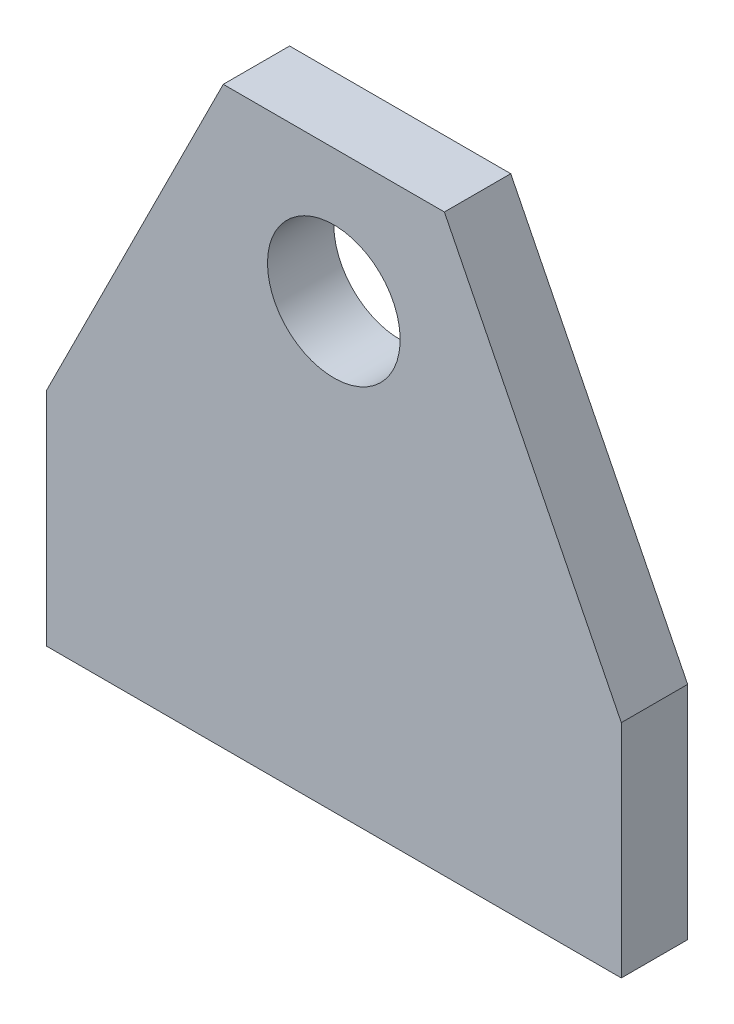
ISO-10303-21;
HEADER;
FILE_DESCRIPTION(('STEP AP214'),'2;1');
FILE_NAME('part.step','',(''),(''),'','','');
FILE_SCHEMA(('AUTOMOTIVE_DESIGN { 1 0 10303 214 1 1 1 1 }'));
ENDSEC;
DATA;
#1=APPLICATION_CONTEXT('core data for automotive mechanical design processes');
#2=APPLICATION_PROTOCOL_DEFINITION('international standard','automotive_design',2000,#1);
#3=PRODUCT_CONTEXT('',#1,'mechanical');
#4=PRODUCT('Part','Part','',(#3));
#5=PRODUCT_RELATED_PRODUCT_CATEGORY('part','',(#4));
#6=PRODUCT_DEFINITION_FORMATION('','',#4);
#7=PRODUCT_DEFINITION_CONTEXT('part definition',#1,'design');
#8=PRODUCT_DEFINITION('design','',#6,#7);
#9=PRODUCT_DEFINITION_SHAPE('','',#8);
#10=(LENGTH_UNIT() NAMED_UNIT(*) SI_UNIT(.MILLI.,.METRE.));
#11=(NAMED_UNIT(*) PLANE_ANGLE_UNIT() SI_UNIT($,.RADIAN.));
#12=(NAMED_UNIT(*) SI_UNIT($,.STERADIAN.) SOLID_ANGLE_UNIT());
#13=UNCERTAINTY_MEASURE_WITH_UNIT(LENGTH_MEASURE(1.E-05),#10,'distance_accuracy_value','');
#14=(GEOMETRIC_REPRESENTATION_CONTEXT(3) GLOBAL_UNCERTAINTY_ASSIGNED_CONTEXT((#13)) GLOBAL_UNIT_ASSIGNED_CONTEXT((#10,
#11,#12)) REPRESENTATION_CONTEXT('',''));
#15=CARTESIAN_POINT('',(0.,0.,0.));
#16=DIRECTION('',(0.,0.,1.));
#17=DIRECTION('',(1.,0.,0.));
#18=AXIS2_PLACEMENT_3D('',#15,#16,#17);
#19=CARTESIAN_POINT('',(41.275,0.,9.525));
#20=DIRECTION('',(0.,0.,-1.));
#21=DIRECTION('',(-1.,0.,0.));
#22=AXIS2_PLACEMENT_3D('',#19,#20,#21);
#23=PLANE('',#22);
#24=DIRECTION('',(0.,-1.,0.));
#25=VECTOR('',#24,1.);
#26=CARTESIAN_POINT('',(41.275,31.75,9.525));
#27=LINE('',#26,#25);
#28=CARTESIAN_POINT('',(41.275,31.75,9.525));
#29=VERTEX_POINT('',#28);
#30=CARTESIAN_POINT('',(41.275,0.,9.525));
#31=VERTEX_POINT('',#30);
#32=EDGE_CURVE('E132',#29,#31,#27,.T.);
#33=ORIENTED_EDGE('',*,*,#32,.F.);
#34=DIRECTION('',(0.447213595499958,-0.894427190999916,0.));
#35=VECTOR('',#34,1.);
#36=CARTESIAN_POINT('',(15.875,82.55,9.525));
#37=LINE('',#36,#35);
#38=CARTESIAN_POINT('',(15.875,82.55,9.525));
#39=VERTEX_POINT('',#38);
#40=EDGE_CURVE('E112',#39,#29,#37,.T.);
#41=ORIENTED_EDGE('',*,*,#40,.F.);
#42=DIRECTION('',(1.,0.,0.));
#43=VECTOR('',#42,1.);
#44=CARTESIAN_POINT('',(-15.875,82.55,9.525));
#45=LINE('',#44,#43);
#46=CARTESIAN_POINT('',(-15.875,82.55,9.525));
#47=VERTEX_POINT('',#46);
#48=EDGE_CURVE('E96',#47,#39,#45,.T.);
#49=ORIENTED_EDGE('',*,*,#48,.F.);
#50=DIRECTION('',(-0.447213595499958,-0.894427190999916,0.));
#51=VECTOR('',#50,1.);
#52=CARTESIAN_POINT('',(-15.875,82.55,9.525));
#53=LINE('',#52,#51);
#54=CARTESIAN_POINT('',(-41.275,31.75,9.525));
#55=VERTEX_POINT('',#54);
#56=EDGE_CURVE('E104',#47,#55,#53,.T.);
#57=ORIENTED_EDGE('',*,*,#56,.T.);
#58=DIRECTION('',(0.,-1.,0.));
#59=VECTOR('',#58,1.);
#60=CARTESIAN_POINT('',(-41.275,31.75,9.525));
#61=LINE('',#60,#59);
#62=CARTESIAN_POINT('',(-41.275,0.,9.525));
#63=VERTEX_POINT('',#62);
#64=EDGE_CURVE('E109',#55,#63,#61,.T.);
#65=ORIENTED_EDGE('',*,*,#64,.T.);
#66=DIRECTION('',(-1.,0.,0.));
#67=VECTOR('',#66,1.);
#68=CARTESIAN_POINT('',(41.275,0.,9.525));
#69=LINE('',#68,#67);
#70=EDGE_CURVE('E174',#31,#63,#69,.T.);
#71=ORIENTED_EDGE('',*,*,#70,.F.);
#72=EDGE_LOOP('',(#33,#41,#49,#57,#65,#71));
#73=FACE_BOUND('',#72,.T.);
#74=CARTESIAN_POINT('',(0.,63.5,9.525));
#75=DIRECTION('',(0.,0.,1.));
#76=DIRECTION('',(1.,0.,0.));
#77=AXIS2_PLACEMENT_3D('',#74,#75,#76);
#78=CIRCLE('',#77,9.525);
#79=CARTESIAN_POINT('',(-9.525,63.5,9.525));
#80=VERTEX_POINT('',#79);
#81=EDGE_CURVE('E121',#80,#80,#78,.T.);
#82=ORIENTED_EDGE('',*,*,#81,.F.);
#83=EDGE_LOOP('',(#82));
#84=FACE_BOUND('',#83,.T.);
#85=ADVANCED_FACE('F34',(#73,#84),#23,.F.);
#86=CARTESIAN_POINT('',(41.275,0.,0.));
#87=DIRECTION('',(0.,0.,-1.));
#88=DIRECTION('',(-1.,0.,0.));
#89=AXIS2_PLACEMENT_3D('',#86,#87,#88);
#90=PLANE('',#89);
#91=DIRECTION('',(0.,-1.,0.));
#92=VECTOR('',#91,1.);
#93=CARTESIAN_POINT('',(41.275,31.75,0.));
#94=LINE('',#93,#92);
#95=CARTESIAN_POINT('',(41.275,31.75,0.));
#96=VERTEX_POINT('',#95);
#97=CARTESIAN_POINT('',(41.275,0.,0.));
#98=VERTEX_POINT('',#97);
#99=EDGE_CURVE('E117',#96,#98,#94,.T.);
#100=ORIENTED_EDGE('',*,*,#99,.T.);
#101=DIRECTION('',(-1.,0.,0.));
#102=VECTOR('',#101,1.);
#103=CARTESIAN_POINT('',(41.275,0.,0.));
#104=LINE('',#103,#102);
#105=CARTESIAN_POINT('',(-41.275,0.,0.));
#106=VERTEX_POINT('',#105);
#107=EDGE_CURVE('E120',#98,#106,#104,.T.);
#108=ORIENTED_EDGE('',*,*,#107,.T.);
#109=DIRECTION('',(0.,-1.,0.));
#110=VECTOR('',#109,1.);
#111=CARTESIAN_POINT('',(-41.275,31.75,0.));
#112=LINE('',#111,#110);
#113=CARTESIAN_POINT('',(-41.275,31.75,0.));
#114=VERTEX_POINT('',#113);
#115=EDGE_CURVE('E124',#114,#106,#112,.T.);
#116=ORIENTED_EDGE('',*,*,#115,.F.);
#117=DIRECTION('',(-0.447213595499958,-0.894427190999916,0.));
#118=VECTOR('',#117,1.);
#119=CARTESIAN_POINT('',(-15.875,82.55,0.));
#120=LINE('',#119,#118);
#121=CARTESIAN_POINT('',(-15.875,82.55,0.));
#122=VERTEX_POINT('',#121);
#123=EDGE_CURVE('E127',#122,#114,#120,.T.);
#124=ORIENTED_EDGE('',*,*,#123,.F.);
#125=DIRECTION('',(1.,0.,0.));
#126=VECTOR('',#125,1.);
#127=CARTESIAN_POINT('',(-15.875,82.55,0.));
#128=LINE('',#127,#126);
#129=CARTESIAN_POINT('',(15.875,82.55,0.));
#130=VERTEX_POINT('',#129);
#131=EDGE_CURVE('E98',#122,#130,#128,.T.);
#132=ORIENTED_EDGE('',*,*,#131,.T.);
#133=DIRECTION('',(0.447213595499958,-0.894427190999916,0.));
#134=VECTOR('',#133,1.);
#135=CARTESIAN_POINT('',(15.875,82.55,0.));
#136=LINE('',#135,#134);
#137=EDGE_CURVE('E130',#130,#96,#136,.T.);
#138=ORIENTED_EDGE('',*,*,#137,.T.);
#139=EDGE_LOOP('',(#100,#108,#116,#124,#132,#138));
#140=FACE_BOUND('',#139,.T.);
#141=CARTESIAN_POINT('',(0.,63.5,0.));
#142=DIRECTION('',(0.,0.,1.));
#143=DIRECTION('',(1.,0.,0.));
#144=AXIS2_PLACEMENT_3D('',#141,#142,#143);
#145=CIRCLE('',#144,9.525);
#146=CARTESIAN_POINT('',(-9.525,63.5,0.));
#147=VERTEX_POINT('',#146);
#148=EDGE_CURVE('E169',#147,#147,#145,.T.);
#149=ORIENTED_EDGE('',*,*,#148,.T.);
#150=EDGE_LOOP('',(#149));
#151=FACE_BOUND('',#150,.T.);
#152=ADVANCED_FACE('F140',(#140,#151),#90,.T.);
#153=CARTESIAN_POINT('',(41.275,31.75,9.525));
#154=DIRECTION('',(1.,0.,0.));
#155=DIRECTION('',(0.,0.,-1.));
#156=AXIS2_PLACEMENT_3D('',#153,#154,#155);
#157=PLANE('',#156);
#158=ORIENTED_EDGE('',*,*,#99,.F.);
#159=DIRECTION('',(0.,0.,-1.));
#160=VECTOR('',#159,1.);
#161=CARTESIAN_POINT('',(41.275,31.75,9.525));
#162=LINE('',#161,#160);
#163=EDGE_CURVE('E11',#29,#96,#162,.T.);
#164=ORIENTED_EDGE('',*,*,#163,.F.);
#165=ORIENTED_EDGE('',*,*,#32,.T.);
#166=DIRECTION('',(0.,0.,-1.));
#167=VECTOR('',#166,1.);
#168=CARTESIAN_POINT('',(41.275,0.,9.525));
#169=LINE('',#168,#167);
#170=EDGE_CURVE('E38',#31,#98,#169,.T.);
#171=ORIENTED_EDGE('',*,*,#170,.T.);
#172=EDGE_LOOP('',(#158,#164,#165,#171));
#173=FACE_BOUND('',#172,.T.);
#174=ADVANCED_FACE('F36',(#173),#157,.T.);
#175=CARTESIAN_POINT('',(15.875,82.55,9.525));
#176=DIRECTION('',(0.894427190999916,0.447213595499958,0.));
#177=DIRECTION('',(-0.447213595499958,0.894427190999916,0.));
#178=AXIS2_PLACEMENT_3D('',#175,#176,#177);
#179=PLANE('',#178);
#180=ORIENTED_EDGE('',*,*,#137,.F.);
#181=DIRECTION('',(0.,0.,-1.));
#182=VECTOR('',#181,1.);
#183=CARTESIAN_POINT('',(15.875,82.55,9.525));
#184=LINE('',#183,#182);
#185=EDGE_CURVE('E44',#39,#130,#184,.T.);
#186=ORIENTED_EDGE('',*,*,#185,.F.);
#187=ORIENTED_EDGE('',*,*,#40,.T.);
#188=ORIENTED_EDGE('',*,*,#163,.T.);
#189=EDGE_LOOP('',(#180,#186,#187,#188));
#190=FACE_BOUND('',#189,.T.);
#191=ADVANCED_FACE('F142',(#190),#179,.T.);
#192=CARTESIAN_POINT('',(-15.875,82.55,9.525));
#193=DIRECTION('',(0.,1.,0.));
#194=DIRECTION('',(0.,0.,1.));
#195=AXIS2_PLACEMENT_3D('',#192,#193,#194);
#196=PLANE('',#195);
#197=ORIENTED_EDGE('',*,*,#131,.F.);
#198=DIRECTION('',(0.,0.,-1.));
#199=VECTOR('',#198,1.);
#200=CARTESIAN_POINT('',(-15.875,82.55,9.525));
#201=LINE('',#200,#199);
#202=EDGE_CURVE('E92',#47,#122,#201,.T.);
#203=ORIENTED_EDGE('',*,*,#202,.F.);
#204=ORIENTED_EDGE('',*,*,#48,.T.);
#205=ORIENTED_EDGE('',*,*,#185,.T.);
#206=EDGE_LOOP('',(#197,#203,#204,#205));
#207=FACE_BOUND('',#206,.T.);
#208=ADVANCED_FACE('F94',(#207),#196,.T.);
#209=CARTESIAN_POINT('',(-15.875,82.55,9.525));
#210=DIRECTION('',(0.894427190999916,-0.447213595499958,0.));
#211=DIRECTION('',(0.447213595499958,0.894427190999916,0.));
#212=AXIS2_PLACEMENT_3D('',#209,#210,#211);
#213=PLANE('',#212);
#214=ORIENTED_EDGE('',*,*,#123,.T.);
#215=DIRECTION('',(0.,0.,-1.));
#216=VECTOR('',#215,1.);
#217=CARTESIAN_POINT('',(-41.275,31.75,9.525));
#218=LINE('',#217,#216);
#219=EDGE_CURVE('E101',#55,#114,#218,.T.);
#220=ORIENTED_EDGE('',*,*,#219,.F.);
#221=ORIENTED_EDGE('',*,*,#56,.F.);
#222=ORIENTED_EDGE('',*,*,#202,.T.);
#223=EDGE_LOOP('',(#214,#220,#221,#222));
#224=FACE_BOUND('',#223,.T.);
#225=ADVANCED_FACE('F105',(#224),#213,.F.);
#226=CARTESIAN_POINT('',(-41.275,31.75,9.525));
#227=DIRECTION('',(1.,0.,0.));
#228=DIRECTION('',(0.,0.,-1.));
#229=AXIS2_PLACEMENT_3D('',#226,#227,#228);
#230=PLANE('',#229);
#231=ORIENTED_EDGE('',*,*,#115,.T.);
#232=DIRECTION('',(0.,0.,-1.));
#233=VECTOR('',#232,1.);
#234=CARTESIAN_POINT('',(-41.275,0.,9.525));
#235=LINE('',#234,#233);
#236=EDGE_CURVE('E135',#63,#106,#235,.T.);
#237=ORIENTED_EDGE('',*,*,#236,.F.);
#238=ORIENTED_EDGE('',*,*,#64,.F.);
#239=ORIENTED_EDGE('',*,*,#219,.T.);
#240=EDGE_LOOP('',(#231,#237,#238,#239));
#241=FACE_BOUND('',#240,.T.);
#242=ADVANCED_FACE('F163',(#241),#230,.F.);
#243=CARTESIAN_POINT('',(41.275,0.,9.525));
#244=DIRECTION('',(0.,-1.,0.));
#245=DIRECTION('',(0.,0.,-1.));
#246=AXIS2_PLACEMENT_3D('',#243,#244,#245);
#247=PLANE('',#246);
#248=ORIENTED_EDGE('',*,*,#107,.F.);
#249=ORIENTED_EDGE('',*,*,#170,.F.);
#250=ORIENTED_EDGE('',*,*,#70,.T.);
#251=ORIENTED_EDGE('',*,*,#236,.T.);
#252=EDGE_LOOP('',(#248,#249,#250,#251));
#253=FACE_BOUND('',#252,.T.);
#254=ADVANCED_FACE('F137',(#253),#247,.T.);
#255=CARTESIAN_POINT('',(0.,63.5,9.525));
#256=DIRECTION('',(0.,0.,-1.));
#257=DIRECTION('',(-1.,0.,0.));
#258=AXIS2_PLACEMENT_3D('',#255,#256,#257);
#259=CYLINDRICAL_SURFACE('',#258,9.525);
#260=CARTESIAN_POINT('',(-9.525,63.5,9.525));
#261=CARTESIAN_POINT('',(-9.525,63.5,9.42578125));
#262=CARTESIAN_POINT('',(-9.525,63.5,9.3265625));
#263=CARTESIAN_POINT('',(-9.525,63.5,9.128125));
#264=CARTESIAN_POINT('',(-9.525,63.5,9.02890625));
#265=CARTESIAN_POINT('',(-9.525,63.5,8.83046875));
#266=CARTESIAN_POINT('',(-9.525,63.5,8.73125));
#267=CARTESIAN_POINT('',(-9.525,63.5,8.5328125));
#268=CARTESIAN_POINT('',(-9.525,63.5,8.43359375));
#269=CARTESIAN_POINT('',(-9.525,63.5,8.23515625));
#270=CARTESIAN_POINT('',(-9.525,63.5,8.1359375));
#271=CARTESIAN_POINT('',(-9.525,63.5,7.9375));
#272=CARTESIAN_POINT('',(-9.525,63.5,7.83828125));
#273=CARTESIAN_POINT('',(-9.525,63.5,7.63984375));
#274=CARTESIAN_POINT('',(-9.525,63.5,7.540625));
#275=CARTESIAN_POINT('',(-9.525,63.5,7.3421875));
#276=CARTESIAN_POINT('',(-9.525,63.5,7.24296875));
#277=CARTESIAN_POINT('',(-9.525,63.5,7.04453125));
#278=CARTESIAN_POINT('',(-9.525,63.5,6.9453125));
#279=CARTESIAN_POINT('',(-9.525,63.5,6.746875));
#280=CARTESIAN_POINT('',(-9.525,63.5,6.64765625));
#281=CARTESIAN_POINT('',(-9.525,63.5,6.44921875));
#282=CARTESIAN_POINT('',(-9.525,63.5,6.35));
#283=CARTESIAN_POINT('',(-9.525,63.5,6.1515625));
#284=CARTESIAN_POINT('',(-9.525,63.5,6.05234375));
#285=CARTESIAN_POINT('',(-9.525,63.5,5.85390625));
#286=CARTESIAN_POINT('',(-9.525,63.5,5.7546875));
#287=CARTESIAN_POINT('',(-9.525,63.5,5.55625));
#288=CARTESIAN_POINT('',(-9.525,63.5,5.45703125));
#289=CARTESIAN_POINT('',(-9.525,63.5,5.25859375));
#290=CARTESIAN_POINT('',(-9.525,63.5,5.159375));
#291=CARTESIAN_POINT('',(-9.525,63.5,4.9609375));
#292=CARTESIAN_POINT('',(-9.525,63.5,4.86171875));
#293=CARTESIAN_POINT('',(-9.525,63.5,4.66328125));
#294=CARTESIAN_POINT('',(-9.525,63.5,4.5640625));
#295=CARTESIAN_POINT('',(-9.525,63.5,4.365625));
#296=CARTESIAN_POINT('',(-9.525,63.5,4.26640625));
#297=CARTESIAN_POINT('',(-9.525,63.5,4.06796875));
#298=CARTESIAN_POINT('',(-9.525,63.5,3.96875));
#299=CARTESIAN_POINT('',(-9.525,63.5,3.7703125));
#300=CARTESIAN_POINT('',(-9.525,63.5,3.67109375));
#301=CARTESIAN_POINT('',(-9.525,63.5,3.47265625));
#302=CARTESIAN_POINT('',(-9.525,63.5,3.3734375));
#303=CARTESIAN_POINT('',(-9.525,63.5,3.175));
#304=CARTESIAN_POINT('',(-9.525,63.5,3.07578125));
#305=CARTESIAN_POINT('',(-9.525,63.5,2.87734375));
#306=CARTESIAN_POINT('',(-9.525,63.5,2.778125));
#307=CARTESIAN_POINT('',(-9.525,63.5,2.5796875));
#308=CARTESIAN_POINT('',(-9.525,63.5,2.48046875));
#309=CARTESIAN_POINT('',(-9.525,63.5,2.28203125));
#310=CARTESIAN_POINT('',(-9.525,63.5,2.1828125));
#311=CARTESIAN_POINT('',(-9.525,63.5,1.984375));
#312=CARTESIAN_POINT('',(-9.525,63.5,1.88515625));
#313=CARTESIAN_POINT('',(-9.525,63.5,1.68671875));
#314=CARTESIAN_POINT('',(-9.525,63.5,1.5875));
#315=CARTESIAN_POINT('',(-9.525,63.5,1.3890625));
#316=CARTESIAN_POINT('',(-9.525,63.5,1.28984375));
#317=CARTESIAN_POINT('',(-9.525,63.5,1.09140625));
#318=CARTESIAN_POINT('',(-9.525,63.5,0.992187500000001));
#319=CARTESIAN_POINT('',(-9.525,63.5,0.793750000000001));
#320=CARTESIAN_POINT('',(-9.525,63.5,0.69453125));
#321=CARTESIAN_POINT('',(-9.525,63.5,0.49609375));
#322=CARTESIAN_POINT('',(-9.525,63.5,0.396875));
#323=CARTESIAN_POINT('',(-9.525,63.5,0.1984375));
#324=CARTESIAN_POINT('',(-9.525,63.5,0.0992187500000001));
#325=CARTESIAN_POINT('',(-9.525,63.5,0.));
#326=B_SPLINE_CURVE_WITH_KNOTS('',3,(#260,#261,#262,#263,#264,#265,#266,#267,#268,#269,#270,
#271,#272,#273,#274,#275,#276,#277,#278,#279,#280,#281,#282,#283,#284,#285,#286,#287,#288,#289,
#290,#291,#292,#293,#294,#295,#296,#297,#298,#299,#300,#301,#302,#303,#304,#305,#306,#307,#308,
#309,#310,#311,#312,#313,#314,#315,#316,#317,#318,#319,#320,#321,#322,#323,#324,#325),
.UNSPECIFIED.,.F.,.F.,(4,2,2,2,2,2,2,2,2,2,2,2,2,2,2,2,2,2,2,2,2,2,2,2,2,2,2,2,2,2,2,2,4),(0.,
0.29765625,0.5953125,0.892968750000001,1.190625,1.48828125,1.7859375,2.08359375,2.38125,
2.67890625,2.9765625,3.27421875,3.571875,3.86953125,4.1671875,4.46484375,4.7625,5.06015625,
5.3578125,5.65546875,5.953125,6.25078125,6.5484375,6.84609375,7.14375,7.44140625,7.7390625,
8.03671875,8.334375,8.63203125,8.9296875,9.22734375,9.525),.UNSPECIFIED.);
#327=EDGE_CURVE('BSEAM157',#80,#147,#326,.T.);
#328=ORIENTED_EDGE('',*,*,#81,.T.);
#329=ORIENTED_EDGE('',*,*,#148,.F.);
#330=ORIENTED_EDGE('',*,*,#327,.T.);
#331=ORIENTED_EDGE('',*,*,#327,.F.);
#332=EDGE_LOOP('',(#328,#330,#329,#331));
#333=FACE_BOUND('',#332,.T.);
#334=ADVANCED_FACE('F157',(#333),#259,.F.);
#335=CLOSED_SHELL('',(#85,#152,#174,#191,#208,#225,#242,#254,#334));
#336=MANIFOLD_SOLID_BREP('B2',#335);
#337=ADVANCED_BREP_SHAPE_REPRESENTATION('',(#18,#336),#14);
#338=SHAPE_DEFINITION_REPRESENTATION(#9,#337);
ENDSEC;
END-ISO-10303-21;
